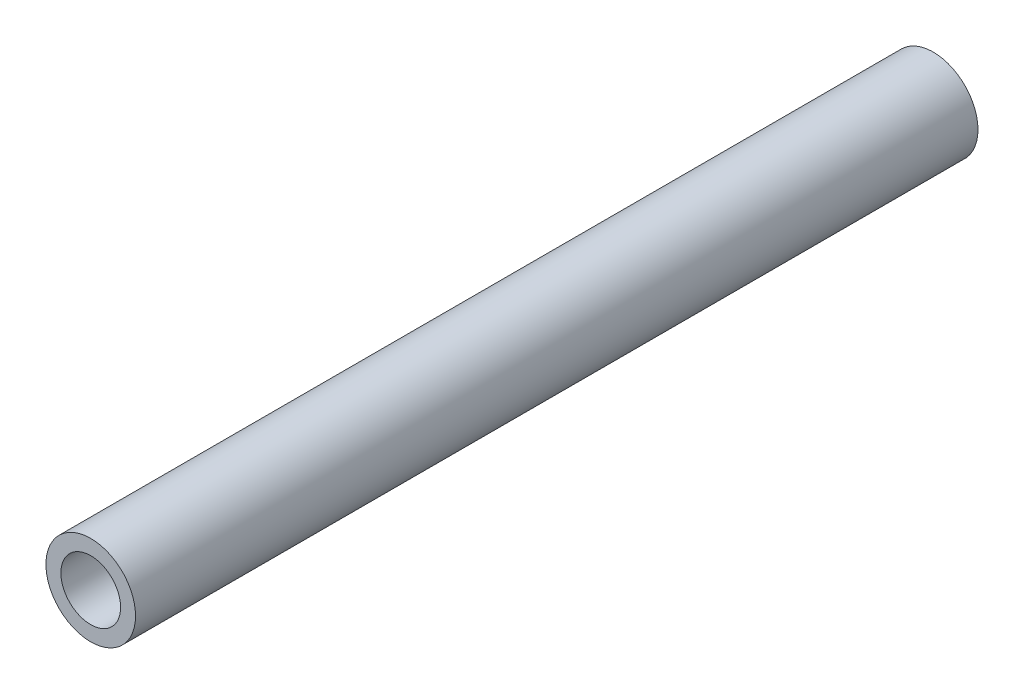
ISO-10303-21;
HEADER;
FILE_DESCRIPTION(('STEP AP214'),'2;1');
FILE_NAME('part.step','',(''),(''),'','','');
FILE_SCHEMA(('AUTOMOTIVE_DESIGN { 1 0 10303 214 1 1 1 1 }'));
ENDSEC;
DATA;
#1=APPLICATION_CONTEXT('core data for automotive mechanical design processes');
#2=APPLICATION_PROTOCOL_DEFINITION('international standard','automotive_design',2000,#1);
#3=PRODUCT_CONTEXT('',#1,'mechanical');
#4=PRODUCT('Part','Part','',(#3));
#5=PRODUCT_RELATED_PRODUCT_CATEGORY('part','',(#4));
#6=PRODUCT_DEFINITION_FORMATION('','',#4);
#7=PRODUCT_DEFINITION_CONTEXT('part definition',#1,'design');
#8=PRODUCT_DEFINITION('design','',#6,#7);
#9=PRODUCT_DEFINITION_SHAPE('','',#8);
#10=(LENGTH_UNIT() NAMED_UNIT(*) SI_UNIT(.MILLI.,.METRE.));
#11=(NAMED_UNIT(*) PLANE_ANGLE_UNIT() SI_UNIT($,.RADIAN.));
#12=(NAMED_UNIT(*) SI_UNIT($,.STERADIAN.) SOLID_ANGLE_UNIT());
#13=UNCERTAINTY_MEASURE_WITH_UNIT(LENGTH_MEASURE(1.E-05),#10,'distance_accuracy_value','');
#14=(GEOMETRIC_REPRESENTATION_CONTEXT(3) GLOBAL_UNCERTAINTY_ASSIGNED_CONTEXT((#13)) GLOBAL_UNIT_ASSIGNED_CONTEXT((#10,
#11,#12)) REPRESENTATION_CONTEXT('',''));
#15=CARTESIAN_POINT('',(0.,0.,0.));
#16=DIRECTION('',(0.,0.,1.));
#17=DIRECTION('',(1.,0.,0.));
#18=AXIS2_PLACEMENT_3D('',#15,#16,#17);
#19=CARTESIAN_POINT('',(0.,0.,56.4));
#20=DIRECTION('',(0.,0.,1.));
#21=DIRECTION('',(1.,0.,0.));
#22=AXIS2_PLACEMENT_3D('',#19,#20,#21);
#23=PLANE('',#22);
#24=CARTESIAN_POINT('',(0.,0.,56.4));
#25=DIRECTION('',(0.,0.,1.));
#26=DIRECTION('',(1.,0.,0.));
#27=AXIS2_PLACEMENT_3D('',#24,#25,#26);
#28=CIRCLE('',#27,3.);
#29=CARTESIAN_POINT('',(3.,0.,56.4));
#30=VERTEX_POINT('',#29);
#31=EDGE_CURVE('E10',#30,#30,#28,.T.);
#32=ORIENTED_EDGE('',*,*,#31,.T.);
#33=EDGE_LOOP('',(#32));
#34=FACE_BOUND('',#33,.T.);
#35=CARTESIAN_POINT('',(0.,0.,56.4));
#36=DIRECTION('',(0.,0.,1.));
#37=DIRECTION('',(1.,0.,0.));
#38=AXIS2_PLACEMENT_3D('',#35,#36,#37);
#39=CIRCLE('',#38,2.);
#40=CARTESIAN_POINT('',(2.,0.,56.4));
#41=VERTEX_POINT('',#40);
#42=EDGE_CURVE('E50',#41,#41,#39,.T.);
#43=ORIENTED_EDGE('',*,*,#42,.F.);
#44=EDGE_LOOP('',(#43));
#45=FACE_BOUND('',#44,.T.);
#46=ADVANCED_FACE('F37',(#34,#45),#23,.T.);
#47=CARTESIAN_POINT('',(0.,0.,0.));
#48=DIRECTION('',(0.,0.,1.));
#49=DIRECTION('',(1.,0.,0.));
#50=AXIS2_PLACEMENT_3D('',#47,#48,#49);
#51=PLANE('',#50);
#52=CARTESIAN_POINT('',(0.,0.,0.));
#53=DIRECTION('',(0.,0.,1.));
#54=DIRECTION('',(1.,0.,0.));
#55=AXIS2_PLACEMENT_3D('',#52,#53,#54);
#56=CIRCLE('',#55,3.);
#57=CARTESIAN_POINT('',(3.,0.,0.));
#58=VERTEX_POINT('',#57);
#59=EDGE_CURVE('E41',#58,#58,#56,.T.);
#60=ORIENTED_EDGE('',*,*,#59,.F.);
#61=EDGE_LOOP('',(#60));
#62=FACE_BOUND('',#61,.T.);
#63=CARTESIAN_POINT('',(0.,0.,0.));
#64=DIRECTION('',(0.,0.,1.));
#65=DIRECTION('',(1.,0.,0.));
#66=AXIS2_PLACEMENT_3D('',#63,#64,#65);
#67=CIRCLE('',#66,2.);
#68=CARTESIAN_POINT('',(2.,0.,0.));
#69=VERTEX_POINT('',#68);
#70=EDGE_CURVE('E52',#69,#69,#67,.T.);
#71=ORIENTED_EDGE('',*,*,#70,.T.);
#72=EDGE_LOOP('',(#71));
#73=FACE_BOUND('',#72,.T.);
#74=ADVANCED_FACE('F64',(#62,#73),#51,.F.);
#75=CARTESIAN_POINT('',(0.,0.,56.4));
#76=DIRECTION('',(0.,0.,-1.));
#77=DIRECTION('',(-1.,0.,0.));
#78=AXIS2_PLACEMENT_3D('',#75,#76,#77);
#79=CYLINDRICAL_SURFACE('',#78,3.);
#80=ORIENTED_EDGE('',*,*,#31,.F.);
#81=EDGE_LOOP('',(#80));
#82=FACE_BOUND('',#81,.T.);
#83=ORIENTED_EDGE('',*,*,#59,.T.);
#84=EDGE_LOOP('',(#83));
#85=FACE_BOUND('',#84,.T.);
#86=ADVANCED_FACE('F39',(#82,#85),#79,.T.);
#87=CARTESIAN_POINT('',(0.,0.,56.4));
#88=DIRECTION('',(0.,0.,-1.));
#89=DIRECTION('',(-1.,0.,0.));
#90=AXIS2_PLACEMENT_3D('',#87,#88,#89);
#91=CYLINDRICAL_SURFACE('',#90,2.);
#92=ORIENTED_EDGE('',*,*,#42,.T.);
#93=EDGE_LOOP('',(#92));
#94=FACE_BOUND('',#93,.T.);
#95=ORIENTED_EDGE('',*,*,#70,.F.);
#96=EDGE_LOOP('',(#95));
#97=FACE_BOUND('',#96,.T.);
#98=ADVANCED_FACE('F60',(#94,#97),#91,.F.);
#99=CLOSED_SHELL('',(#46,#74,#86,#98));
#100=MANIFOLD_SOLID_BREP('B2',#99);
#101=ADVANCED_BREP_SHAPE_REPRESENTATION('',(#18,#100),#14);
#102=SHAPE_DEFINITION_REPRESENTATION(#9,#101);
ENDSEC;
END-ISO-10303-21;
